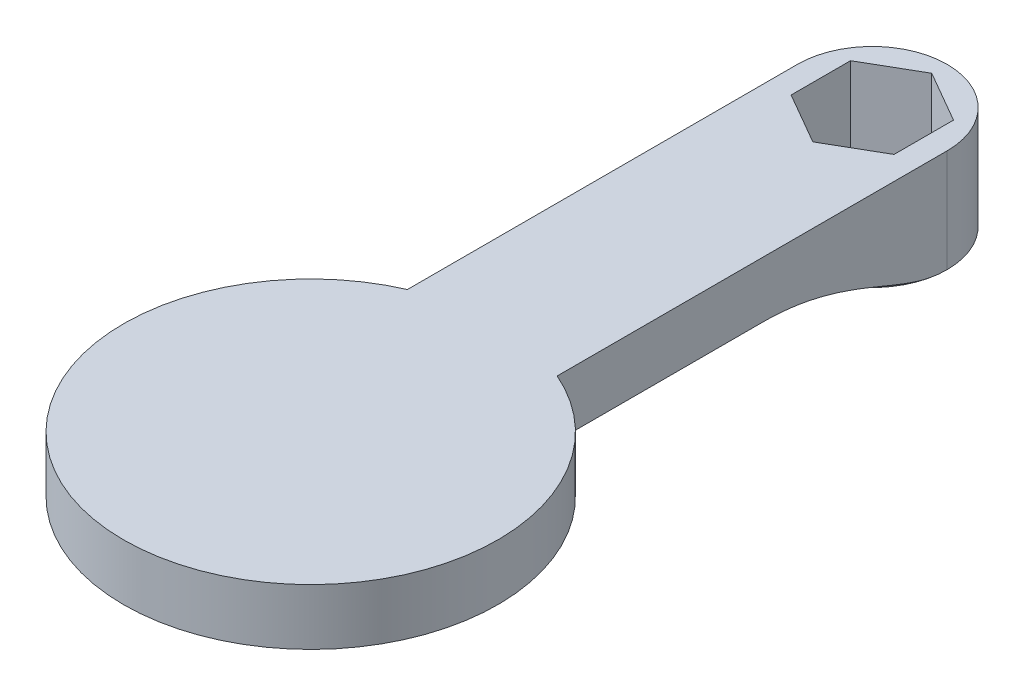
ISO-10303-21;
HEADER;
FILE_DESCRIPTION(('STEP AP214'),'2;1');
FILE_NAME('part.step','',(''),(''),'','','');
FILE_SCHEMA(('AUTOMOTIVE_DESIGN { 1 0 10303 214 1 1 1 1 }'));
ENDSEC;
DATA;
#1=APPLICATION_CONTEXT('core data for automotive mechanical design processes');
#2=APPLICATION_PROTOCOL_DEFINITION('international standard','automotive_design',2000,#1);
#3=PRODUCT_CONTEXT('',#1,'mechanical');
#4=PRODUCT('Part','Part','',(#3));
#5=PRODUCT_RELATED_PRODUCT_CATEGORY('part','',(#4));
#6=PRODUCT_DEFINITION_FORMATION('','',#4);
#7=PRODUCT_DEFINITION_CONTEXT('part definition',#1,'design');
#8=PRODUCT_DEFINITION('design','',#6,#7);
#9=PRODUCT_DEFINITION_SHAPE('','',#8);
#10=(LENGTH_UNIT() NAMED_UNIT(*) SI_UNIT(.MILLI.,.METRE.));
#11=(NAMED_UNIT(*) PLANE_ANGLE_UNIT() SI_UNIT($,.RADIAN.));
#12=(NAMED_UNIT(*) SI_UNIT($,.STERADIAN.) SOLID_ANGLE_UNIT());
#13=UNCERTAINTY_MEASURE_WITH_UNIT(LENGTH_MEASURE(1.E-05),#10,'distance_accuracy_value','');
#14=(GEOMETRIC_REPRESENTATION_CONTEXT(3) GLOBAL_UNCERTAINTY_ASSIGNED_CONTEXT((#13)) GLOBAL_UNIT_ASSIGNED_CONTEXT((#10,
#11,#12)) REPRESENTATION_CONTEXT('',''));
#15=CARTESIAN_POINT('',(0.,0.,0.));
#16=DIRECTION('',(0.,0.,1.));
#17=DIRECTION('',(1.,0.,0.));
#18=AXIS2_PLACEMENT_3D('',#15,#16,#17);
#19=CARTESIAN_POINT('',(0.,0.,0.));
#20=DIRECTION('',(0.,1.,0.));
#21=DIRECTION('',(0.,0.,1.));
#22=AXIS2_PLACEMENT_3D('',#19,#20,#21);
#23=PLANE('',#22);
#24=CARTESIAN_POINT('',(0.,0.,0.));
#25=DIRECTION('',(0.,1.,0.));
#26=DIRECTION('',(0.,0.,1.));
#27=AXIS2_PLACEMENT_3D('',#24,#25,#26);
#28=CIRCLE('',#27,4.);
#29=CARTESIAN_POINT('',(4.,0.,0.));
#30=VERTEX_POINT('',#29);
#31=CARTESIAN_POINT('',(-4.,0.,0.));
#32=VERTEX_POINT('',#31);
#33=EDGE_CURVE('E244',#30,#32,#28,.T.);
#34=ORIENTED_EDGE('',*,*,#33,.F.);
#35=EDGE_CURVE('E243',#32,#30,#28,.T.);
#36=ORIENTED_EDGE('',*,*,#35,.F.);
#37=EDGE_LOOP('',(#34,#36));
#38=FACE_BOUND('',#37,.T.);
#39=DIRECTION('',(-0.866025403784439,0.,-0.5));
#40=VECTOR('',#39,1.);
#41=CARTESIAN_POINT('',(2.75,0.,-1.58771324027147));
#42=LINE('',#41,#40);
#43=CARTESIAN_POINT('',(2.75,0.,-1.58771324027147));
#44=VERTEX_POINT('',#43);
#45=CARTESIAN_POINT('',(0.,0.,-3.17542648054294));
#46=VERTEX_POINT('',#45);
#47=EDGE_CURVE('E207',#44,#46,#42,.T.);
#48=ORIENTED_EDGE('',*,*,#47,.T.);
#49=DIRECTION('',(-0.866025403784439,0.,0.5));
#50=VECTOR('',#49,1.);
#51=CARTESIAN_POINT('',(0.,0.,-3.17542648054294));
#52=LINE('',#51,#50);
#53=CARTESIAN_POINT('',(-2.75,0.,-1.58771324027147));
#54=VERTEX_POINT('',#53);
#55=EDGE_CURVE('E211',#46,#54,#52,.T.);
#56=ORIENTED_EDGE('',*,*,#55,.T.);
#57=DIRECTION('',(0.,0.,1.));
#58=VECTOR('',#57,1.);
#59=CARTESIAN_POINT('',(-2.75,0.,-1.58771324027147));
#60=LINE('',#59,#58);
#61=CARTESIAN_POINT('',(-2.75,0.,1.58771324027147));
#62=VERTEX_POINT('',#61);
#63=EDGE_CURVE('E215',#54,#62,#60,.T.);
#64=ORIENTED_EDGE('',*,*,#63,.T.);
#65=DIRECTION('',(0.866025403784439,0.,0.5));
#66=VECTOR('',#65,1.);
#67=CARTESIAN_POINT('',(-2.75,0.,1.58771324027147));
#68=LINE('',#67,#66);
#69=CARTESIAN_POINT('',(0.,0.,3.17542648054294));
#70=VERTEX_POINT('',#69);
#71=EDGE_CURVE('E136',#62,#70,#68,.T.);
#72=ORIENTED_EDGE('',*,*,#71,.T.);
#73=DIRECTION('',(0.866025403784439,0.,-0.5));
#74=VECTOR('',#73,1.);
#75=CARTESIAN_POINT('',(0.,0.,3.17542648054294));
#76=LINE('',#75,#74);
#77=CARTESIAN_POINT('',(2.75,0.,1.58771324027147));
#78=VERTEX_POINT('',#77);
#79=EDGE_CURVE('E220',#70,#78,#76,.T.);
#80=ORIENTED_EDGE('',*,*,#79,.T.);
#81=DIRECTION('',(0.,0.,-1.));
#82=VECTOR('',#81,1.);
#83=CARTESIAN_POINT('',(2.75,0.,1.58771324027147));
#84=LINE('',#83,#82);
#85=EDGE_CURVE('E224',#78,#44,#84,.T.);
#86=ORIENTED_EDGE('',*,*,#85,.T.);
#87=EDGE_LOOP('',(#48,#56,#64,#72,#80,#86));
#88=FACE_BOUND('',#87,.T.);
#89=ADVANCED_FACE('F38',(#38,#88),#23,.F.);
#90=CARTESIAN_POINT('',(0.,2.5,0.));
#91=DIRECTION('',(0.,-1.,0.));
#92=DIRECTION('',(0.,0.,-1.));
#93=AXIS2_PLACEMENT_3D('',#90,#91,#92);
#94=CYLINDRICAL_SURFACE('',#93,4.);
#95=DIRECTION('',(0.,-1.,0.));
#96=VECTOR('',#95,1.);
#97=CARTESIAN_POINT('',(4.,5.5,0.));
#98=LINE('',#97,#96);
#99=CARTESIAN_POINT('',(4.,5.5,0.));
#100=VERTEX_POINT('',#99);
#101=EDGE_CURVE('E67',#100,#30,#98,.T.);
#102=ORIENTED_EDGE('',*,*,#101,.T.);
#103=ORIENTED_EDGE('',*,*,#33,.T.);
#104=DIRECTION('',(0.,-1.,0.));
#105=VECTOR('',#104,1.);
#106=CARTESIAN_POINT('',(-4.,5.5,0.));
#107=LINE('',#106,#105);
#108=CARTESIAN_POINT('',(-4.,5.5,0.));
#109=VERTEX_POINT('',#108);
#110=EDGE_CURVE('E59',#109,#32,#107,.T.);
#111=ORIENTED_EDGE('',*,*,#110,.F.);
#112=CARTESIAN_POINT('',(0.,5.5,0.));
#113=DIRECTION('',(0.,1.,0.));
#114=DIRECTION('',(0.,0.,1.));
#115=AXIS2_PLACEMENT_3D('',#112,#113,#114);
#116=CIRCLE('',#115,4.);
#117=EDGE_CURVE('E173',#100,#109,#116,.T.);
#118=ORIENTED_EDGE('',*,*,#117,.F.);
#119=EDGE_LOOP('',(#102,#103,#111,#118));
#120=FACE_BOUND('',#119,.T.);
#121=ADVANCED_FACE('F290',(#120),#94,.T.);
#122=CARTESIAN_POINT('',(2.75,2.5,-1.58771324027147));
#123=DIRECTION('',(-0.5,0.,0.866025403784439));
#124=DIRECTION('',(0.866025403784439,0.,0.5));
#125=AXIS2_PLACEMENT_3D('',#122,#123,#124);
#126=PLANE('',#125);
#127=ORIENTED_EDGE('',*,*,#47,.F.);
#128=DIRECTION('',(0.,-1.,0.));
#129=VECTOR('',#128,1.);
#130=CARTESIAN_POINT('',(2.75,2.5,-1.58771324027147));
#131=LINE('',#130,#129);
#132=CARTESIAN_POINT('',(2.75,5.5,-1.58771324027147));
#133=VERTEX_POINT('',#132);
#134=EDGE_CURVE('E228',#133,#44,#131,.T.);
#135=ORIENTED_EDGE('',*,*,#134,.F.);
#136=DIRECTION('',(-0.866025403784439,0.,-0.5));
#137=VECTOR('',#136,1.);
#138=CARTESIAN_POINT('',(2.75,5.5,-1.58771324027147));
#139=LINE('',#138,#137);
#140=CARTESIAN_POINT('',(0.,5.5,-3.17542648054294));
#141=VERTEX_POINT('',#140);
#142=EDGE_CURVE('E165',#133,#141,#139,.T.);
#143=ORIENTED_EDGE('',*,*,#142,.T.);
#144=DIRECTION('',(0.,-1.,0.));
#145=VECTOR('',#144,1.);
#146=CARTESIAN_POINT('',(0.,2.5,-3.17542648054294));
#147=LINE('',#146,#145);
#148=EDGE_CURVE('E239',#141,#46,#147,.T.);
#149=ORIENTED_EDGE('',*,*,#148,.T.);
#150=EDGE_LOOP('',(#127,#135,#143,#149));
#151=FACE_BOUND('',#150,.T.);
#152=ADVANCED_FACE('F286',(#151),#126,.T.);
#153=CARTESIAN_POINT('',(0.,2.5,-3.17542648054294));
#154=DIRECTION('',(0.5,0.,0.866025403784439));
#155=DIRECTION('',(0.866025403784439,0.,-0.5));
#156=AXIS2_PLACEMENT_3D('',#153,#154,#155);
#157=PLANE('',#156);
#158=ORIENTED_EDGE('',*,*,#55,.F.);
#159=ORIENTED_EDGE('',*,*,#148,.F.);
#160=DIRECTION('',(-0.866025403784439,0.,0.5));
#161=VECTOR('',#160,1.);
#162=CARTESIAN_POINT('',(0.,5.5,-3.17542648054294));
#163=LINE('',#162,#161);
#164=CARTESIAN_POINT('',(-2.75,5.5,-1.58771324027147));
#165=VERTEX_POINT('',#164);
#166=EDGE_CURVE('E169',#141,#165,#163,.T.);
#167=ORIENTED_EDGE('',*,*,#166,.T.);
#168=DIRECTION('',(0.,-1.,0.));
#169=VECTOR('',#168,1.);
#170=CARTESIAN_POINT('',(-2.75,2.5,-1.58771324027147));
#171=LINE('',#170,#169);
#172=EDGE_CURVE('E141',#165,#54,#171,.T.);
#173=ORIENTED_EDGE('',*,*,#172,.T.);
#174=EDGE_LOOP('',(#158,#159,#167,#173));
#175=FACE_BOUND('',#174,.T.);
#176=ADVANCED_FACE('F283',(#175),#157,.T.);
#177=CARTESIAN_POINT('',(-2.75,2.5,-1.58771324027147));
#178=DIRECTION('',(1.,0.,0.));
#179=DIRECTION('',(0.,0.,-1.));
#180=AXIS2_PLACEMENT_3D('',#177,#178,#179);
#181=PLANE('',#180);
#182=ORIENTED_EDGE('',*,*,#63,.F.);
#183=ORIENTED_EDGE('',*,*,#172,.F.);
#184=DIRECTION('',(0.,0.,1.));
#185=VECTOR('',#184,1.);
#186=CARTESIAN_POINT('',(-2.75,5.5,-1.58771324027147));
#187=LINE('',#186,#185);
#188=CARTESIAN_POINT('',(-2.75,5.5,1.58771324027147));
#189=VERTEX_POINT('',#188);
#190=EDGE_CURVE('E145',#165,#189,#187,.T.);
#191=ORIENTED_EDGE('',*,*,#190,.T.);
#192=DIRECTION('',(0.,-1.,0.));
#193=VECTOR('',#192,1.);
#194=CARTESIAN_POINT('',(-2.75,2.5,1.58771324027147));
#195=LINE('',#194,#193);
#196=EDGE_CURVE('E129',#189,#62,#195,.T.);
#197=ORIENTED_EDGE('',*,*,#196,.T.);
#198=EDGE_LOOP('',(#182,#183,#191,#197));
#199=FACE_BOUND('',#198,.T.);
#200=ADVANCED_FACE('F146',(#199),#181,.T.);
#201=CARTESIAN_POINT('',(-2.75,2.5,1.58771324027147));
#202=DIRECTION('',(0.5,0.,-0.866025403784439));
#203=DIRECTION('',(-0.866025403784439,0.,-0.5));
#204=AXIS2_PLACEMENT_3D('',#201,#202,#203);
#205=PLANE('',#204);
#206=ORIENTED_EDGE('',*,*,#71,.F.);
#207=ORIENTED_EDGE('',*,*,#196,.F.);
#208=DIRECTION('',(0.866025403784439,0.,0.5));
#209=VECTOR('',#208,1.);
#210=CARTESIAN_POINT('',(-2.75,5.5,1.58771324027147));
#211=LINE('',#210,#209);
#212=CARTESIAN_POINT('',(0.,5.5,3.17542648054294));
#213=VERTEX_POINT('',#212);
#214=EDGE_CURVE('E133',#189,#213,#211,.T.);
#215=ORIENTED_EDGE('',*,*,#214,.T.);
#216=DIRECTION('',(0.,-1.,0.));
#217=VECTOR('',#216,1.);
#218=CARTESIAN_POINT('',(0.,2.5,3.17542648054294));
#219=LINE('',#218,#217);
#220=EDGE_CURVE('E142',#213,#70,#219,.T.);
#221=ORIENTED_EDGE('',*,*,#220,.T.);
#222=EDGE_LOOP('',(#206,#207,#215,#221));
#223=FACE_BOUND('',#222,.T.);
#224=ADVANCED_FACE('F131',(#223),#205,.T.);
#225=CARTESIAN_POINT('',(0.,2.5,3.17542648054294));
#226=DIRECTION('',(-0.5,0.,-0.866025403784439));
#227=DIRECTION('',(-0.866025403784439,0.,0.5));
#228=AXIS2_PLACEMENT_3D('',#225,#226,#227);
#229=PLANE('',#228);
#230=ORIENTED_EDGE('',*,*,#79,.F.);
#231=ORIENTED_EDGE('',*,*,#220,.F.);
#232=DIRECTION('',(0.866025403784439,0.,-0.5));
#233=VECTOR('',#232,1.);
#234=CARTESIAN_POINT('',(0.,5.5,3.17542648054294));
#235=LINE('',#234,#233);
#236=CARTESIAN_POINT('',(2.75,5.5,1.58771324027147));
#237=VERTEX_POINT('',#236);
#238=EDGE_CURVE('E155',#213,#237,#235,.T.);
#239=ORIENTED_EDGE('',*,*,#238,.T.);
#240=DIRECTION('',(0.,-1.,0.));
#241=VECTOR('',#240,1.);
#242=CARTESIAN_POINT('',(2.75,2.5,1.58771324027147));
#243=LINE('',#242,#241);
#244=EDGE_CURVE('E232',#237,#78,#243,.T.);
#245=ORIENTED_EDGE('',*,*,#244,.T.);
#246=EDGE_LOOP('',(#230,#231,#239,#245));
#247=FACE_BOUND('',#246,.T.);
#248=ADVANCED_FACE('F274',(#247),#229,.T.);
#249=CARTESIAN_POINT('',(2.75,2.5,1.58771324027147));
#250=DIRECTION('',(-1.,0.,0.));
#251=DIRECTION('',(0.,0.,1.));
#252=AXIS2_PLACEMENT_3D('',#249,#250,#251);
#253=PLANE('',#252);
#254=ORIENTED_EDGE('',*,*,#85,.F.);
#255=ORIENTED_EDGE('',*,*,#244,.F.);
#256=DIRECTION('',(0.,0.,-1.));
#257=VECTOR('',#256,1.);
#258=CARTESIAN_POINT('',(2.75,5.5,1.58771324027147));
#259=LINE('',#258,#257);
#260=EDGE_CURVE('E159',#237,#133,#259,.T.);
#261=ORIENTED_EDGE('',*,*,#260,.T.);
#262=ORIENTED_EDGE('',*,*,#134,.T.);
#263=EDGE_LOOP('',(#254,#255,#261,#262));
#264=FACE_BOUND('',#263,.T.);
#265=ADVANCED_FACE('F271',(#264),#253,.T.);
#266=CARTESIAN_POINT('',(0.,2.5,0.));
#267=DIRECTION('',(0.,1.,0.));
#268=DIRECTION('',(0.,0.,1.));
#269=AXIS2_PLACEMENT_3D('',#266,#267,#268);
#270=PLANE('',#269);
#271=DIRECTION('',(0.,0.,1.));
#272=VECTOR('',#271,1.);
#273=CARTESIAN_POINT('',(-4.,2.5,20.8348486100883));
#274=LINE('',#273,#272);
#275=CARTESIAN_POINT('',(-4.,2.5,9.83183737768744));
#276=VERTEX_POINT('',#275);
#277=CARTESIAN_POINT('',(-4.,2.5,20.8348486100883));
#278=VERTEX_POINT('',#277);
#279=EDGE_CURVE('E172',#276,#278,#274,.T.);
#280=ORIENTED_EDGE('',*,*,#279,.F.);
#281=CARTESIAN_POINT('',(0.,2.5,0.));
#282=DIRECTION('',(0.,1.,0.));
#283=DIRECTION('',(0.,0.,1.));
#284=AXIS2_PLACEMENT_3D('',#281,#282,#283);
#285=CIRCLE('',#284,10.6143782776615);
#286=CARTESIAN_POINT('',(4.,2.5,9.83183737768744));
#287=VERTEX_POINT('',#286);
#288=EDGE_CURVE('E247',#276,#287,#285,.T.);
#289=ORIENTED_EDGE('',*,*,#288,.T.);
#290=DIRECTION('',(0.,0.,-1.));
#291=VECTOR('',#290,1.);
#292=CARTESIAN_POINT('',(4.,2.5,0.));
#293=LINE('',#292,#291);
#294=CARTESIAN_POINT('',(4.,2.5,20.8348486100883));
#295=VERTEX_POINT('',#294);
#296=EDGE_CURVE('E178',#295,#287,#293,.T.);
#297=ORIENTED_EDGE('',*,*,#296,.F.);
#298=CARTESIAN_POINT('',(0.,2.5,30.));
#299=DIRECTION('',(0.,1.,0.));
#300=DIRECTION('',(0.,0.,1.));
#301=AXIS2_PLACEMENT_3D('',#298,#299,#300);
#302=CIRCLE('',#301,10.);
#303=EDGE_CURVE('E189',#278,#295,#302,.T.);
#304=ORIENTED_EDGE('',*,*,#303,.F.);
#305=EDGE_LOOP('',(#280,#289,#297,#304));
#306=FACE_BOUND('',#305,.T.);
#307=ADVANCED_FACE('F263',(#306),#270,.F.);
#308=CARTESIAN_POINT('',(0.,5.5,0.));
#309=DIRECTION('',(0.,1.,0.));
#310=DIRECTION('',(0.,0.,1.));
#311=AXIS2_PLACEMENT_3D('',#308,#309,#310);
#312=PLANE('',#311);
#313=ORIENTED_EDGE('',*,*,#117,.T.);
#314=DIRECTION('',(0.,0.,1.));
#315=VECTOR('',#314,1.);
#316=CARTESIAN_POINT('',(-4.,5.5,20.8348486100883));
#317=LINE('',#316,#315);
#318=CARTESIAN_POINT('',(-4.,5.5,20.8348486100883));
#319=VERTEX_POINT('',#318);
#320=EDGE_CURVE('E177',#109,#319,#317,.T.);
#321=ORIENTED_EDGE('',*,*,#320,.T.);
#322=CARTESIAN_POINT('',(0.,5.5,30.));
#323=DIRECTION('',(0.,1.,0.));
#324=DIRECTION('',(0.,0.,1.));
#325=AXIS2_PLACEMENT_3D('',#322,#323,#324);
#326=CIRCLE('',#325,10.);
#327=CARTESIAN_POINT('',(4.,5.5,20.8348486100883));
#328=VERTEX_POINT('',#327);
#329=EDGE_CURVE('E181',#319,#328,#326,.T.);
#330=ORIENTED_EDGE('',*,*,#329,.T.);
#331=DIRECTION('',(0.,0.,-1.));
#332=VECTOR('',#331,1.);
#333=CARTESIAN_POINT('',(4.,5.5,0.));
#334=LINE('',#333,#332);
#335=EDGE_CURVE('E184',#328,#100,#334,.T.);
#336=ORIENTED_EDGE('',*,*,#335,.T.);
#337=EDGE_LOOP('',(#313,#321,#330,#336));
#338=FACE_BOUND('',#337,.T.);
#339=ORIENTED_EDGE('',*,*,#214,.F.);
#340=ORIENTED_EDGE('',*,*,#190,.F.);
#341=ORIENTED_EDGE('',*,*,#166,.F.);
#342=ORIENTED_EDGE('',*,*,#142,.F.);
#343=ORIENTED_EDGE('',*,*,#260,.F.);
#344=ORIENTED_EDGE('',*,*,#238,.F.);
#345=EDGE_LOOP('',(#339,#340,#341,#342,#343,#344));
#346=FACE_BOUND('',#345,.T.);
#347=ADVANCED_FACE('F152',(#338,#346),#312,.T.);
#348=CARTESIAN_POINT('',(-4.,5.5,20.8348486100883));
#349=DIRECTION('',(1.,0.,0.));
#350=DIRECTION('',(0.,0.,-1.));
#351=AXIS2_PLACEMENT_3D('',#348,#349,#350);
#352=PLANE('',#351);
#353=ORIENTED_EDGE('',*,*,#110,.T.);
#354=CARTESIAN_POINT('',(-4.,0.,0.));
#355=CARTESIAN_POINT('',(-4.,-1.50382574423313E-05,0.0712696697157347));
#356=CARTESIAN_POINT('',(-4.,0.00167946006965753,0.142534238714265));
#357=CARTESIAN_POINT('',(-4.,0.00837542732378062,0.284886864506334));
#358=CARTESIAN_POINT('',(-4.,0.0133758873126166,0.355974968512922));
#359=CARTESIAN_POINT('',(-4.,0.0265469706859894,0.4975850354183));
#360=CARTESIAN_POINT('',(-4.,0.0347055924003048,0.568108122101422));
#361=CARTESIAN_POINT('',(-4.,0.0539901930793361,0.708745735048207));
#362=CARTESIAN_POINT('',(-4.,0.0651163541688941,0.778860235966036));
#363=CARTESIAN_POINT('',(-4.,0.102523600610465,0.988126117991129));
#364=CARTESIAN_POINT('',(-4.,0.132869630721765,1.12656390210911));
#365=CARTESIAN_POINT('',(-4.,0.184833105688915,1.33258636951375));
#366=CARTESIAN_POINT('',(-4.,0.203238841032485,1.40102099088188));
#367=CARTESIAN_POINT('',(-4.,0.241909718987385,1.53735595894413));
#368=CARTESIAN_POINT('',(-4.,0.26217461062278,1.60525637641311));
#369=CARTESIAN_POINT('',(-4.,0.329599131257596,1.82189152627697));
#370=CARTESIAN_POINT('',(-4.,0.379804594497871,1.96967557349092));
#371=CARTESIAN_POINT('',(-4.,0.4852659251922,2.26344101434997));
#372=CARTESIAN_POINT('',(-4.,0.540523379608473,2.40942182509247));
#373=CARTESIAN_POINT('',(-4.,0.654029719487995,2.70039221384029));
#374=CARTESIAN_POINT('',(-4.,0.712281868506834,2.84538050659959));
#375=CARTESIAN_POINT('',(-4.,0.83003951483409,3.13482131741149));
#376=CARTESIAN_POINT('',(-4.,0.889544862492412,3.27927389704021));
#377=CARTESIAN_POINT('',(-4.,1.00863445150464,3.56854104836864));
#378=CARTESIAN_POINT('',(-4.,1.06821855338574,3.71335567890455));
#379=CARTESIAN_POINT('',(-4.,1.18626561693526,4.00344709470925));
#380=CARTESIAN_POINT('',(-4.,1.24472855561299,4.14872388938416));
#381=CARTESIAN_POINT('',(-4.,1.35963139241111,4.43997453617191));
#382=CARTESIAN_POINT('',(-4.,1.41607254780431,4.58594788878525));
#383=CARTESIAN_POINT('',(-4.,1.52625975665586,4.8789070460121));
#384=CARTESIAN_POINT('',(-4.,1.58000581603153,5.02589284840189));
#385=CARTESIAN_POINT('',(-4.,1.73566617898221,5.46688517915365));
#386=CARTESIAN_POINT('',(-4.,1.83269946403287,5.76265070990224));
#387=CARTESIAN_POINT('',(-4.,2.00992016431013,6.35932956524074));
#388=CARTESIAN_POINT('',(-4.,2.09010301274562,6.6602442615187));
#389=CARTESIAN_POINT('',(-4.,2.23063557350413,7.26618030361204));
#390=CARTESIAN_POINT('',(-4.,2.29101835164052,7.57119390816005));
#391=CARTESIAN_POINT('',(-4.,2.3899103941729,8.18467151490829));
#392=CARTESIAN_POINT('',(-4.,2.42842987218953,8.49313383722232));
#393=CARTESIAN_POINT('',(-4.,2.46992563006392,8.9729365514246));
#394=CARTESIAN_POINT('',(-4.,2.48109564952037,9.14359720192023));
#395=CARTESIAN_POINT('',(-4.,2.49616796750454,9.48677428684481));
#396=CARTESIAN_POINT('',(-4.,2.50000406030006,9.6592936174519));
#397=CARTESIAN_POINT('',(-4.,2.5,9.83183737768744));
#398=B_SPLINE_CURVE_WITH_KNOTS('',3,(#354,#355,#356,#357,#358,#359,#360,#361,#362,#363,#364,
#365,#366,#367,#368,#369,#370,#371,#372,#373,#374,#375,#376,#377,#378,#379,#380,#381,#382,#383,
#384,#385,#386,#387,#388,#389,#390,#391,#392,#393,#394,#395,#396,#397),.UNSPECIFIED.,.F.,.F.,(4,
2,2,2,2,2,2,2,2,2,2,2,2,2,2,2,2,2,2,2,2,4),(0.,0.213780544310909,0.427495875569681,
0.640406893569411,0.853330981424924,1.27808488253224,1.49066839092471,1.70322324381455,
2.17129672399877,2.63951774679881,3.1082603148776,3.57694722216666,4.0467267521045,
4.51651590511087,4.98600765420363,5.45549837244124,6.3889053776235,7.32256502866701,
8.25465744615361,9.18631406984769,9.69924980034376,10.2167944988603),.UNSPECIFIED.);
#399=EDGE_CURVE('E11',#32,#276,#398,.T.);
#400=ORIENTED_EDGE('',*,*,#399,.T.);
#401=ORIENTED_EDGE('',*,*,#279,.T.);
#402=DIRECTION('',(0.,-1.,0.));
#403=VECTOR('',#402,1.);
#404=CARTESIAN_POINT('',(-4.,5.5,20.8348486100883));
#405=LINE('',#404,#403);
#406=EDGE_CURVE('E201',#319,#278,#405,.T.);
#407=ORIENTED_EDGE('',*,*,#406,.F.);
#408=ORIENTED_EDGE('',*,*,#320,.F.);
#409=EDGE_LOOP('',(#353,#400,#401,#407,#408));
#410=FACE_BOUND('',#409,.T.);
#411=ADVANCED_FACE('F266',(#410),#352,.F.);
#412=CARTESIAN_POINT('',(0.,5.5,30.));
#413=DIRECTION('',(0.,-1.,0.));
#414=DIRECTION('',(0.,0.,-1.));
#415=AXIS2_PLACEMENT_3D('',#412,#413,#414);
#416=CYLINDRICAL_SURFACE('',#415,10.);
#417=ORIENTED_EDGE('',*,*,#303,.T.);
#418=DIRECTION('',(0.,-1.,0.));
#419=VECTOR('',#418,1.);
#420=CARTESIAN_POINT('',(4.,5.5,20.8348486100883));
#421=LINE('',#420,#419);
#422=EDGE_CURVE('E197',#328,#295,#421,.T.);
#423=ORIENTED_EDGE('',*,*,#422,.F.);
#424=ORIENTED_EDGE('',*,*,#329,.F.);
#425=ORIENTED_EDGE('',*,*,#406,.T.);
#426=EDGE_LOOP('',(#417,#423,#424,#425));
#427=FACE_BOUND('',#426,.T.);
#428=ADVANCED_FACE('F261',(#427),#416,.T.);
#429=CARTESIAN_POINT('',(4.,5.5,0.));
#430=DIRECTION('',(-1.,0.,0.));
#431=DIRECTION('',(0.,0.,1.));
#432=AXIS2_PLACEMENT_3D('',#429,#430,#431);
#433=PLANE('',#432);
#434=ORIENTED_EDGE('',*,*,#296,.T.);
#435=CARTESIAN_POINT('',(4.,2.5,9.83183737768744));
#436=CARTESIAN_POINT('',(4.,2.50000748058684,9.65454591357292));
#437=CARTESIAN_POINT('',(4.,2.4959551748226,9.47726629504367));
#438=CARTESIAN_POINT('',(4.,2.47997336535884,9.12309226598938));
#439=CARTESIAN_POINT('',(4.,2.46804525679267,8.94619779280613));
#440=CARTESIAN_POINT('',(4.,2.43656018337496,8.59316133516819));
#441=CARTESIAN_POINT('',(4.,2.41700619285683,8.41701908436859));
#442=CARTESIAN_POINT('',(4.,2.37057369543406,8.06570677746651));
#443=CARTESIAN_POINT('',(4.,2.34369487228922,7.89053676367238));
#444=CARTESIAN_POINT('',(4.,2.25285773154237,7.36851773955544));
#445=CARTESIAN_POINT('',(4.,2.17853846307236,7.02343203711286));
#446=CARTESIAN_POINT('',(4.,2.00560896903254,6.33961091918552));
#447=CARTESIAN_POINT('',(4.,1.90700395308731,6.00087415851402));
#448=CARTESIAN_POINT('',(4.,1.72289663596517,5.43124847712451));
#449=CARTESIAN_POINT('',(4.,1.64243738224675,5.19869802003192));
#450=CARTESIAN_POINT('',(4.,1.47401954263944,4.73638747302475));
#451=CARTESIAN_POINT('',(4.,1.38606210879018,4.50662696063091));
#452=CARTESIAN_POINT('',(4.,1.20535439599144,4.04928746346457));
#453=CARTESIAN_POINT('',(4.,1.11260891412027,3.82170655601491));
#454=CARTESIAN_POINT('',(4.,0.97248851446949,3.48062575961015));
#455=CARTESIAN_POINT('',(4.,0.925591875954827,3.366925943794));
#456=CARTESIAN_POINT('',(4.,0.832070953144872,3.13941460181342));
#457=CARTESIAN_POINT('',(4.,0.785446666321173,3.02560307669755));
#458=CARTESIAN_POINT('',(4.,0.692301499842215,2.79548200229782));
#459=CARTESIAN_POINT('',(4.,0.645798478152641,2.67916518010786));
#460=CARTESIAN_POINT('',(4.,0.554668730701913,2.44580153941149));
#461=CARTESIAN_POINT('',(4.,0.510041885279978,2.32875476800903));
#462=CARTESIAN_POINT('',(4.,0.423845674272882,2.09389951634443));
#463=CARTESIAN_POINT('',(4.,0.382268147550477,1.97609406135393));
#464=CARTESIAN_POINT('',(4.,0.303290528846418,1.73905662753719));
#465=CARTESIAN_POINT('',(4.,0.265891007146524,1.61982445642269));
#466=CARTESIAN_POINT('',(4.,0.196390881705049,1.37850432163747));
#467=CARTESIAN_POINT('',(4.,0.16434713285178,1.25639971351271));
#468=CARTESIAN_POINT('',(4.,0.107669377682913,1.01052889092907));
#469=CARTESIAN_POINT('',(4.,0.0830311223103365,0.886763672032363));
#470=CARTESIAN_POINT('',(4.,0.0424998877650769,0.636422247264011));
#471=CARTESIAN_POINT('',(4.,0.0267016937659719,0.509830165661566));
#472=CARTESIAN_POINT('',(4.,0.0107562238518514,0.319170847802599));
#473=CARTESIAN_POINT('',(4.,0.00673288464799951,0.255413229881166));
#474=CARTESIAN_POINT('',(4.,0.00135083733998656,0.127773119455232));
#475=CARTESIAN_POINT('',(4.,-7.33123910519364E-06,0.0638906042865507));
#476=CARTESIAN_POINT('',(4.,0.,0.));
#477=B_SPLINE_CURVE_WITH_KNOTS('',3,(#435,#436,#437,#438,#439,#440,#441,#442,#443,#444,#445,
#446,#447,#448,#449,#450,#451,#452,#453,#454,#455,#456,#457,#458,#459,#460,#461,#462,#463,#464,
#465,#466,#467,#468,#469,#470,#471,#472,#473,#474,#475,#476),.UNSPECIFIED.,.F.,.F.,(4,2,2,2,2,2,
2,2,2,2,2,2,2,2,2,2,2,2,2,2,4),(0.,0.531810006689156,1.06352583289736,1.59503448031116,
2.12656607856216,3.18443951266501,4.24208621581193,4.98016667364797,5.71813393458947,
6.45537566682131,6.82435182098873,7.19332454426282,7.56912079479677,7.94489304092081,
8.31961980587096,8.6943976572608,9.07293108035567,9.45124689553294,9.83354496750397,
10.0251484504668,10.2167907167712),.UNSPECIFIED.);
#478=EDGE_CURVE('E53',#287,#30,#477,.T.);
#479=ORIENTED_EDGE('',*,*,#478,.T.);
#480=ORIENTED_EDGE('',*,*,#101,.F.);
#481=ORIENTED_EDGE('',*,*,#335,.F.);
#482=ORIENTED_EDGE('',*,*,#422,.T.);
#483=EDGE_LOOP('',(#434,#479,#480,#481,#482));
#484=FACE_BOUND('',#483,.T.);
#485=ADVANCED_FACE('F256',(#484),#433,.F.);
#486=CARTESIAN_POINT('',(0.,-7.5,0.));
#487=DIRECTION('',(0.,1.,0.));
#488=DIRECTION('',(0.,0.,1.));
#489=AXIS2_PLACEMENT_3D('',#486,#487,#488);
#490=TOROIDAL_SURFACE('',#489,10.6143782776615,10.);
#491=ORIENTED_EDGE('',*,*,#399,.F.);
#492=ORIENTED_EDGE('',*,*,#35,.T.);
#493=ORIENTED_EDGE('',*,*,#478,.F.);
#494=ORIENTED_EDGE('',*,*,#288,.F.);
#495=EDGE_LOOP('',(#491,#492,#493,#494));
#496=FACE_BOUND('',#495,.T.);
#497=ADVANCED_FACE('F40',(#496),#490,.F.);
#498=CLOSED_SHELL('',(#89,#121,#152,#176,#200,#224,#248,#265,#307,#347,#411,#428,#485,#497));
#499=MANIFOLD_SOLID_BREP('B2',#498);
#500=ADVANCED_BREP_SHAPE_REPRESENTATION('',(#18,#499),#14);
#501=SHAPE_DEFINITION_REPRESENTATION(#9,#500);
ENDSEC;
END-ISO-10303-21;
